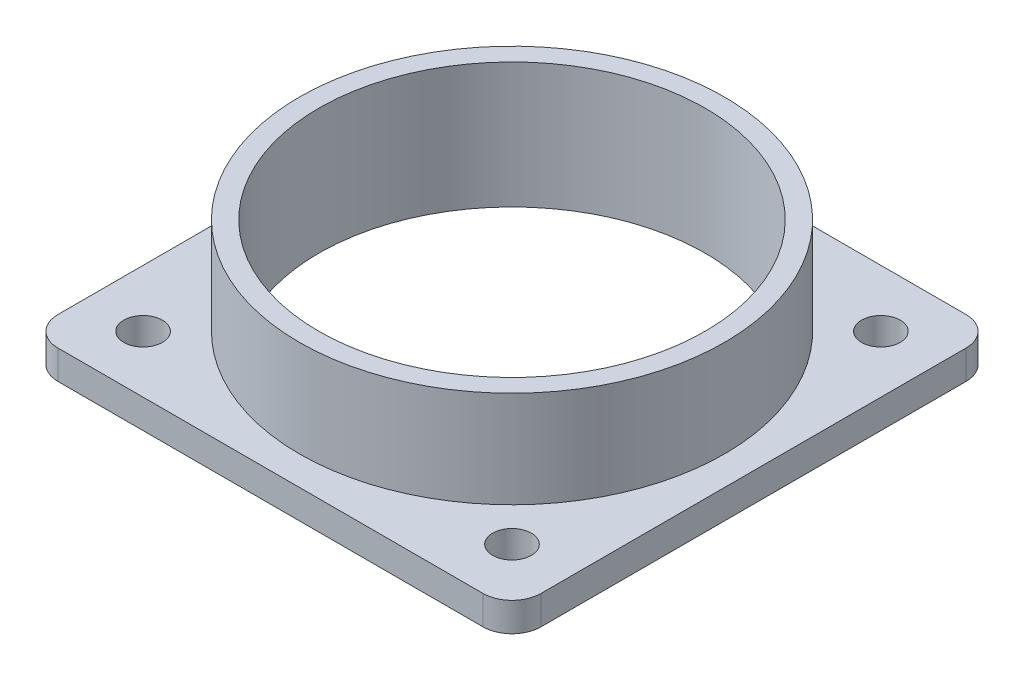
ISO-10303-21;
HEADER;
FILE_DESCRIPTION(('STEP AP214'),'2;1');
FILE_NAME('part.step','',(''),(''),'','','');
FILE_SCHEMA(('AUTOMOTIVE_DESIGN { 1 0 10303 214 1 1 1 1 }'));
ENDSEC;
DATA;
#1=APPLICATION_CONTEXT('core data for automotive mechanical design processes');
#2=APPLICATION_PROTOCOL_DEFINITION('international standard','automotive_design',2000,#1);
#3=PRODUCT_CONTEXT('',#1,'mechanical');
#4=PRODUCT('Part','Part','',(#3));
#5=PRODUCT_RELATED_PRODUCT_CATEGORY('part','',(#4));
#6=PRODUCT_DEFINITION_FORMATION('','',#4);
#7=PRODUCT_DEFINITION_CONTEXT('part definition',#1,'design');
#8=PRODUCT_DEFINITION('design','',#6,#7);
#9=PRODUCT_DEFINITION_SHAPE('','',#8);
#10=(LENGTH_UNIT() NAMED_UNIT(*) SI_UNIT(.MILLI.,.METRE.));
#11=(NAMED_UNIT(*) PLANE_ANGLE_UNIT() SI_UNIT($,.RADIAN.));
#12=(NAMED_UNIT(*) SI_UNIT($,.STERADIAN.) SOLID_ANGLE_UNIT());
#13=UNCERTAINTY_MEASURE_WITH_UNIT(LENGTH_MEASURE(1.E-05),#10,'distance_accuracy_value','');
#14=(GEOMETRIC_REPRESENTATION_CONTEXT(3) GLOBAL_UNCERTAINTY_ASSIGNED_CONTEXT((#13)) GLOBAL_UNIT_ASSIGNED_CONTEXT((#10,
#11,#12)) REPRESENTATION_CONTEXT('',''));
#15=CARTESIAN_POINT('',(0.,0.,0.));
#16=DIRECTION('',(0.,0.,1.));
#17=DIRECTION('',(1.,0.,0.));
#18=AXIS2_PLACEMENT_3D('',#15,#16,#17);
#19=CARTESIAN_POINT('',(0.,3.,0.));
#20=DIRECTION('',(0.,1.,0.));
#21=DIRECTION('',(0.,0.,1.));
#22=AXIS2_PLACEMENT_3D('',#19,#20,#21);
#23=PLANE('',#22);
#24=CARTESIAN_POINT('',(-19.0918830920357,3.,19.0918830920368));
#25=DIRECTION('',(0.,1.,0.));
#26=DIRECTION('',(0.,0.,1.));
#27=AXIS2_PLACEMENT_3D('',#24,#25,#26);
#28=CIRCLE('',#27,2.00000000000058);
#29=CARTESIAN_POINT('',(-19.0918830920357,3.,21.0918830920374));
#30=VERTEX_POINT('',#29);
#31=EDGE_CURVE('E196',#30,#30,#28,.T.);
#32=ORIENTED_EDGE('',*,*,#31,.F.);
#33=EDGE_LOOP('',(#32));
#34=FACE_BOUND('',#33,.T.);
#35=CARTESIAN_POINT('',(19.0918830920368,3.,-19.0918830920379));
#36=DIRECTION('',(0.,1.,0.));
#37=DIRECTION('',(0.,0.,1.));
#38=AXIS2_PLACEMENT_3D('',#35,#36,#37);
#39=CIRCLE('',#38,2.00000000000111);
#40=CARTESIAN_POINT('',(19.0918830920368,3.,-17.0918830920367));
#41=VERTEX_POINT('',#40);
#42=EDGE_CURVE('E184',#41,#41,#39,.T.);
#43=ORIENTED_EDGE('',*,*,#42,.F.);
#44=EDGE_LOOP('',(#43));
#45=FACE_BOUND('',#44,.T.);
#46=DIRECTION('',(0.,0.,-1.));
#47=VECTOR('',#46,1.);
#48=CARTESIAN_POINT('',(25.,3.,25.));
#49=LINE('',#48,#47);
#50=CARTESIAN_POINT('',(25.,3.,22.));
#51=VERTEX_POINT('',#50);
#52=CARTESIAN_POINT('',(25.,3.,-22.));
#53=VERTEX_POINT('',#52);
#54=EDGE_CURVE('E137',#51,#53,#49,.T.);
#55=ORIENTED_EDGE('',*,*,#54,.T.);
#56=CARTESIAN_POINT('',(22.,3.,-22.));
#57=DIRECTION('',(0.,1.,0.));
#58=DIRECTION('',(0.,0.,1.));
#59=AXIS2_PLACEMENT_3D('',#56,#57,#58);
#60=CIRCLE('',#59,3.);
#61=CARTESIAN_POINT('',(22.,3.,-25.));
#62=VERTEX_POINT('',#61);
#63=EDGE_CURVE('E156',#53,#62,#60,.T.);
#64=ORIENTED_EDGE('',*,*,#63,.T.);
#65=DIRECTION('',(-1.,0.,0.));
#66=VECTOR('',#65,1.);
#67=CARTESIAN_POINT('',(25.,3.,-25.));
#68=LINE('',#67,#66);
#69=CARTESIAN_POINT('',(-22.,3.,-25.));
#70=VERTEX_POINT('',#69);
#71=EDGE_CURVE('E120',#62,#70,#68,.T.);
#72=ORIENTED_EDGE('',*,*,#71,.T.);
#73=CARTESIAN_POINT('',(-22.,3.,-22.));
#74=DIRECTION('',(0.,1.,0.));
#75=DIRECTION('',(0.,0.,1.));
#76=AXIS2_PLACEMENT_3D('',#73,#74,#75);
#77=CIRCLE('',#76,3.);
#78=CARTESIAN_POINT('',(-25.,3.,-22.));
#79=VERTEX_POINT('',#78);
#80=EDGE_CURVE('E151',#70,#79,#77,.T.);
#81=ORIENTED_EDGE('',*,*,#80,.T.);
#82=DIRECTION('',(0.,0.,1.));
#83=VECTOR('',#82,1.);
#84=CARTESIAN_POINT('',(-25.,3.,-25.));
#85=LINE('',#84,#83);
#86=CARTESIAN_POINT('',(-25.,3.,22.));
#87=VERTEX_POINT('',#86);
#88=EDGE_CURVE('E167',#79,#87,#85,.T.);
#89=ORIENTED_EDGE('',*,*,#88,.T.);
#90=CARTESIAN_POINT('',(-22.,3.,22.));
#91=DIRECTION('',(0.,1.,0.));
#92=DIRECTION('',(0.,0.,1.));
#93=AXIS2_PLACEMENT_3D('',#90,#91,#92);
#94=CIRCLE('',#93,3.);
#95=CARTESIAN_POINT('',(-22.,3.,25.));
#96=VERTEX_POINT('',#95);
#97=EDGE_CURVE('E56',#87,#96,#94,.T.);
#98=ORIENTED_EDGE('',*,*,#97,.T.);
#99=DIRECTION('',(1.,0.,0.));
#100=VECTOR('',#99,1.);
#101=CARTESIAN_POINT('',(-25.,3.,25.));
#102=LINE('',#101,#100);
#103=CARTESIAN_POINT('',(22.,3.,25.));
#104=VERTEX_POINT('',#103);
#105=EDGE_CURVE('E175',#96,#104,#102,.T.);
#106=ORIENTED_EDGE('',*,*,#105,.T.);
#107=CARTESIAN_POINT('',(22.,3.,22.));
#108=DIRECTION('',(0.,1.,0.));
#109=DIRECTION('',(0.,0.,1.));
#110=AXIS2_PLACEMENT_3D('',#107,#108,#109);
#111=CIRCLE('',#110,3.);
#112=EDGE_CURVE('E154',#104,#51,#111,.T.);
#113=ORIENTED_EDGE('',*,*,#112,.T.);
#114=EDGE_LOOP('',(#55,#64,#72,#81,#89,#98,#106,#113));
#115=FACE_BOUND('',#114,.T.);
#116=CARTESIAN_POINT('',(-19.0918830920368,3.,-19.0918830920368));
#117=DIRECTION('',(0.,1.,0.));
#118=DIRECTION('',(0.,0.,1.));
#119=AXIS2_PLACEMENT_3D('',#116,#117,#118);
#120=CIRCLE('',#119,2.);
#121=CARTESIAN_POINT('',(-19.0918830920368,3.,-17.0918830920368));
#122=VERTEX_POINT('',#121);
#123=EDGE_CURVE('E134',#122,#122,#120,.T.);
#124=ORIENTED_EDGE('',*,*,#123,.F.);
#125=EDGE_LOOP('',(#124));
#126=FACE_BOUND('',#125,.T.);
#127=CARTESIAN_POINT('',(19.0918830920379,3.,19.0918830920357));
#128=DIRECTION('',(0.,1.,0.));
#129=DIRECTION('',(0.,0.,1.));
#130=AXIS2_PLACEMENT_3D('',#127,#128,#129);
#131=CIRCLE('',#130,2.00000000000152);
#132=CARTESIAN_POINT('',(19.0918830920379,3.,21.0918830920372));
#133=VERTEX_POINT('',#132);
#134=EDGE_CURVE('E190',#133,#133,#131,.T.);
#135=ORIENTED_EDGE('',*,*,#134,.F.);
#136=EDGE_LOOP('',(#135));
#137=FACE_BOUND('',#136,.T.);
#138=CARTESIAN_POINT('',(0.,3.,0.));
#139=DIRECTION('',(0.,1.,0.));
#140=DIRECTION('',(0.,0.,1.));
#141=AXIS2_PLACEMENT_3D('',#138,#139,#140);
#142=CIRCLE('',#141,22.);
#143=CARTESIAN_POINT('',(0.,3.,22.));
#144=VERTEX_POINT('',#143);
#145=EDGE_CURVE('E205',#144,#144,#142,.T.);
#146=ORIENTED_EDGE('',*,*,#145,.F.);
#147=EDGE_LOOP('',(#146));
#148=FACE_BOUND('',#147,.T.);
#149=ADVANCED_FACE('F34',(#34,#45,#115,#126,#137,#148),#23,.T.);
#150=CARTESIAN_POINT('',(0.,0.,0.));
#151=DIRECTION('',(0.,1.,0.));
#152=DIRECTION('',(0.,0.,1.));
#153=AXIS2_PLACEMENT_3D('',#150,#151,#152);
#154=PLANE('',#153);
#155=DIRECTION('',(-1.,0.,0.));
#156=VECTOR('',#155,1.);
#157=CARTESIAN_POINT('',(0.,0.,-25.));
#158=LINE('',#157,#156);
#159=CARTESIAN_POINT('',(22.,0.,-25.));
#160=VERTEX_POINT('',#159);
#161=CARTESIAN_POINT('',(-22.,0.,-25.));
#162=VERTEX_POINT('',#161);
#163=EDGE_CURVE('E117',#160,#162,#158,.T.);
#164=ORIENTED_EDGE('',*,*,#163,.F.);
#165=CARTESIAN_POINT('',(22.,0.,-22.));
#166=DIRECTION('',(0.,1.,0.));
#167=DIRECTION('',(0.,0.,1.));
#168=AXIS2_PLACEMENT_3D('',#165,#166,#167);
#169=CIRCLE('',#168,3.);
#170=CARTESIAN_POINT('',(25.,0.,-22.));
#171=VERTEX_POINT('',#170);
#172=EDGE_CURVE('E100',#160,#171,#169,.F.);
#173=ORIENTED_EDGE('',*,*,#172,.T.);
#174=DIRECTION('',(0.,0.,-1.));
#175=VECTOR('',#174,1.);
#176=CARTESIAN_POINT('',(25.,0.,25.));
#177=LINE('',#176,#175);
#178=CARTESIAN_POINT('',(25.,0.,22.));
#179=VERTEX_POINT('',#178);
#180=EDGE_CURVE('E141',#179,#171,#177,.T.);
#181=ORIENTED_EDGE('',*,*,#180,.F.);
#182=CARTESIAN_POINT('',(22.,0.,22.));
#183=DIRECTION('',(0.,1.,0.));
#184=DIRECTION('',(0.,0.,1.));
#185=AXIS2_PLACEMENT_3D('',#182,#183,#184);
#186=CIRCLE('',#185,3.);
#187=CARTESIAN_POINT('',(22.,0.,25.));
#188=VERTEX_POINT('',#187);
#189=EDGE_CURVE('E111',#179,#188,#186,.F.);
#190=ORIENTED_EDGE('',*,*,#189,.T.);
#191=DIRECTION('',(1.,0.,0.));
#192=VECTOR('',#191,1.);
#193=CARTESIAN_POINT('',(-25.,0.,25.));
#194=LINE('',#193,#192);
#195=CARTESIAN_POINT('',(-22.,0.,25.));
#196=VERTEX_POINT('',#195);
#197=EDGE_CURVE('E131',#196,#188,#194,.T.);
#198=ORIENTED_EDGE('',*,*,#197,.F.);
#199=CARTESIAN_POINT('',(-22.,0.,22.));
#200=DIRECTION('',(0.,1.,0.));
#201=DIRECTION('',(0.,0.,1.));
#202=AXIS2_PLACEMENT_3D('',#199,#200,#201);
#203=CIRCLE('',#202,3.);
#204=CARTESIAN_POINT('',(-25.,0.,22.));
#205=VERTEX_POINT('',#204);
#206=EDGE_CURVE('E145',#196,#205,#203,.F.);
#207=ORIENTED_EDGE('',*,*,#206,.T.);
#208=DIRECTION('',(0.,0.,1.));
#209=VECTOR('',#208,1.);
#210=CARTESIAN_POINT('',(-25.,0.,-25.));
#211=LINE('',#210,#209);
#212=CARTESIAN_POINT('',(-25.,0.,-22.));
#213=VERTEX_POINT('',#212);
#214=EDGE_CURVE('E127',#213,#205,#211,.T.);
#215=ORIENTED_EDGE('',*,*,#214,.F.);
#216=CARTESIAN_POINT('',(-22.,0.,-22.));
#217=DIRECTION('',(0.,1.,0.));
#218=DIRECTION('',(0.,0.,1.));
#219=AXIS2_PLACEMENT_3D('',#216,#217,#218);
#220=CIRCLE('',#219,3.);
#221=EDGE_CURVE('E121',#213,#162,#220,.F.);
#222=ORIENTED_EDGE('',*,*,#221,.T.);
#223=EDGE_LOOP('',(#164,#173,#181,#190,#198,#207,#215,#222));
#224=FACE_BOUND('',#223,.T.);
#225=CARTESIAN_POINT('',(0.,0.,0.));
#226=DIRECTION('',(0.,1.,0.));
#227=DIRECTION('',(0.,0.,1.));
#228=AXIS2_PLACEMENT_3D('',#225,#226,#227);
#229=CIRCLE('',#228,20.);
#230=CARTESIAN_POINT('',(0.,0.,20.));
#231=VERTEX_POINT('',#230);
#232=EDGE_CURVE('E128',#231,#231,#229,.T.);
#233=ORIENTED_EDGE('',*,*,#232,.T.);
#234=EDGE_LOOP('',(#233));
#235=FACE_BOUND('',#234,.T.);
#236=CARTESIAN_POINT('',(-19.0918830920368,0.,-19.0918830920368));
#237=DIRECTION('',(0.,1.,0.));
#238=DIRECTION('',(0.,0.,1.));
#239=AXIS2_PLACEMENT_3D('',#236,#237,#238);
#240=CIRCLE('',#239,2.);
#241=CARTESIAN_POINT('',(-19.0918830920368,0.,-17.0918830920368));
#242=VERTEX_POINT('',#241);
#243=EDGE_CURVE('E181',#242,#242,#240,.T.);
#244=ORIENTED_EDGE('',*,*,#243,.T.);
#245=EDGE_LOOP('',(#244));
#246=FACE_BOUND('',#245,.T.);
#247=CARTESIAN_POINT('',(19.0918830920368,0.,-19.0918830920379));
#248=DIRECTION('',(0.,1.,0.));
#249=DIRECTION('',(0.,0.,1.));
#250=AXIS2_PLACEMENT_3D('',#247,#248,#249);
#251=CIRCLE('',#250,2.00000000000111);
#252=CARTESIAN_POINT('',(19.0918830920368,0.,-17.0918830920367));
#253=VERTEX_POINT('',#252);
#254=EDGE_CURVE('E187',#253,#253,#251,.T.);
#255=ORIENTED_EDGE('',*,*,#254,.T.);
#256=EDGE_LOOP('',(#255));
#257=FACE_BOUND('',#256,.T.);
#258=CARTESIAN_POINT('',(19.0918830920379,0.,19.0918830920357));
#259=DIRECTION('',(0.,1.,0.));
#260=DIRECTION('',(0.,0.,1.));
#261=AXIS2_PLACEMENT_3D('',#258,#259,#260);
#262=CIRCLE('',#261,2.00000000000152);
#263=CARTESIAN_POINT('',(19.0918830920379,0.,21.0918830920372));
#264=VERTEX_POINT('',#263);
#265=EDGE_CURVE('E193',#264,#264,#262,.T.);
#266=ORIENTED_EDGE('',*,*,#265,.T.);
#267=EDGE_LOOP('',(#266));
#268=FACE_BOUND('',#267,.T.);
#269=CARTESIAN_POINT('',(-19.0918830920357,0.,19.0918830920368));
#270=DIRECTION('',(0.,1.,0.));
#271=DIRECTION('',(0.,0.,1.));
#272=AXIS2_PLACEMENT_3D('',#269,#270,#271);
#273=CIRCLE('',#272,2.00000000000058);
#274=CARTESIAN_POINT('',(-19.0918830920357,0.,21.0918830920374));
#275=VERTEX_POINT('',#274);
#276=EDGE_CURVE('E199',#275,#275,#273,.T.);
#277=ORIENTED_EDGE('',*,*,#276,.T.);
#278=EDGE_LOOP('',(#277));
#279=FACE_BOUND('',#278,.T.);
#280=ADVANCED_FACE('F124',(#224,#235,#246,#257,#268,#279),#154,.F.);
#281=CARTESIAN_POINT('',(0.,3.,-25.));
#282=DIRECTION('',(0.,0.,1.));
#283=DIRECTION('',(1.,0.,0.));
#284=AXIS2_PLACEMENT_3D('',#281,#282,#283);
#285=PLANE('',#284);
#286=ORIENTED_EDGE('',*,*,#71,.F.);
#287=DIRECTION('',(0.,-1.,0.));
#288=VECTOR('',#287,1.);
#289=CARTESIAN_POINT('',(22.,3.,-25.));
#290=LINE('',#289,#288);
#291=EDGE_CURVE('E104',#62,#160,#290,.T.);
#292=ORIENTED_EDGE('',*,*,#291,.T.);
#293=ORIENTED_EDGE('',*,*,#163,.T.);
#294=DIRECTION('',(0.,-1.,0.));
#295=VECTOR('',#294,1.);
#296=CARTESIAN_POINT('',(-22.,3.,-25.));
#297=LINE('',#296,#295);
#298=EDGE_CURVE('E122',#162,#70,#297,.F.);
#299=ORIENTED_EDGE('',*,*,#298,.T.);
#300=EDGE_LOOP('',(#286,#292,#293,#299));
#301=FACE_BOUND('',#300,.T.);
#302=ADVANCED_FACE('F116',(#301),#285,.F.);
#303=CARTESIAN_POINT('',(-25.,3.,-25.));
#304=DIRECTION('',(1.,0.,0.));
#305=DIRECTION('',(0.,0.,-1.));
#306=AXIS2_PLACEMENT_3D('',#303,#304,#305);
#307=PLANE('',#306);
#308=ORIENTED_EDGE('',*,*,#214,.T.);
#309=DIRECTION('',(0.,-1.,0.));
#310=VECTOR('',#309,1.);
#311=CARTESIAN_POINT('',(-25.,3.,22.));
#312=LINE('',#311,#310);
#313=EDGE_CURVE('E11',#205,#87,#312,.F.);
#314=ORIENTED_EDGE('',*,*,#313,.T.);
#315=ORIENTED_EDGE('',*,*,#88,.F.);
#316=DIRECTION('',(0.,-1.,0.));
#317=VECTOR('',#316,1.);
#318=CARTESIAN_POINT('',(-25.,3.,-22.));
#319=LINE('',#318,#317);
#320=EDGE_CURVE('E42',#79,#213,#319,.T.);
#321=ORIENTED_EDGE('',*,*,#320,.T.);
#322=EDGE_LOOP('',(#308,#314,#315,#321));
#323=FACE_BOUND('',#322,.T.);
#324=ADVANCED_FACE('F165',(#323),#307,.F.);
#325=CARTESIAN_POINT('',(-25.,3.,25.));
#326=DIRECTION('',(0.,0.,-1.));
#327=DIRECTION('',(-1.,0.,0.));
#328=AXIS2_PLACEMENT_3D('',#325,#326,#327);
#329=PLANE('',#328);
#330=ORIENTED_EDGE('',*,*,#197,.T.);
#331=DIRECTION('',(0.,-1.,0.));
#332=VECTOR('',#331,1.);
#333=CARTESIAN_POINT('',(22.,3.,25.));
#334=LINE('',#333,#332);
#335=EDGE_CURVE('E49',#188,#104,#334,.F.);
#336=ORIENTED_EDGE('',*,*,#335,.T.);
#337=ORIENTED_EDGE('',*,*,#105,.F.);
#338=DIRECTION('',(0.,-1.,0.));
#339=VECTOR('',#338,1.);
#340=CARTESIAN_POINT('',(-22.,3.,25.));
#341=LINE('',#340,#339);
#342=EDGE_CURVE('E158',#96,#196,#341,.T.);
#343=ORIENTED_EDGE('',*,*,#342,.T.);
#344=EDGE_LOOP('',(#330,#336,#337,#343));
#345=FACE_BOUND('',#344,.T.);
#346=ADVANCED_FACE('F174',(#345),#329,.F.);
#347=CARTESIAN_POINT('',(25.,3.,25.));
#348=DIRECTION('',(-1.,0.,0.));
#349=DIRECTION('',(0.,0.,1.));
#350=AXIS2_PLACEMENT_3D('',#347,#348,#349);
#351=PLANE('',#350);
#352=ORIENTED_EDGE('',*,*,#180,.T.);
#353=DIRECTION('',(0.,-1.,0.));
#354=VECTOR('',#353,1.);
#355=CARTESIAN_POINT('',(25.,3.,-22.));
#356=LINE('',#355,#354);
#357=EDGE_CURVE('E105',#171,#53,#356,.F.);
#358=ORIENTED_EDGE('',*,*,#357,.T.);
#359=ORIENTED_EDGE('',*,*,#54,.F.);
#360=DIRECTION('',(0.,-1.,0.));
#361=VECTOR('',#360,1.);
#362=CARTESIAN_POINT('',(25.,3.,22.));
#363=LINE('',#362,#361);
#364=EDGE_CURVE('E110',#51,#179,#363,.T.);
#365=ORIENTED_EDGE('',*,*,#364,.T.);
#366=EDGE_LOOP('',(#352,#358,#359,#365));
#367=FACE_BOUND('',#366,.T.);
#368=ADVANCED_FACE('F239',(#367),#351,.F.);
#369=CARTESIAN_POINT('',(0.,3.,0.));
#370=DIRECTION('',(0.,-1.,0.));
#371=DIRECTION('',(0.,0.,-1.));
#372=AXIS2_PLACEMENT_3D('',#369,#370,#371);
#373=CYLINDRICAL_SURFACE('',#372,20.);
#374=ORIENTED_EDGE('',*,*,#232,.F.);
#375=EDGE_LOOP('',(#374));
#376=FACE_BOUND('',#375,.T.);
#377=CARTESIAN_POINT('',(0.,13.,0.));
#378=DIRECTION('',(0.,1.,0.));
#379=DIRECTION('',(0.,0.,1.));
#380=AXIS2_PLACEMENT_3D('',#377,#378,#379);
#381=CIRCLE('',#380,20.);
#382=CARTESIAN_POINT('',(0.,13.,20.));
#383=VERTEX_POINT('',#382);
#384=EDGE_CURVE('E208',#383,#383,#381,.T.);
#385=ORIENTED_EDGE('',*,*,#384,.T.);
#386=EDGE_LOOP('',(#385));
#387=FACE_BOUND('',#386,.T.);
#388=ADVANCED_FACE('F214',(#376,#387),#373,.F.);
#389=CARTESIAN_POINT('',(-19.0918830920368,3.,-19.0918830920368));
#390=DIRECTION('',(0.,-1.,0.));
#391=DIRECTION('',(0.,0.,-1.));
#392=AXIS2_PLACEMENT_3D('',#389,#390,#391);
#393=CYLINDRICAL_SURFACE('',#392,2.);
#394=ORIENTED_EDGE('',*,*,#123,.T.);
#395=EDGE_LOOP('',(#394));
#396=FACE_BOUND('',#395,.T.);
#397=ORIENTED_EDGE('',*,*,#243,.F.);
#398=EDGE_LOOP('',(#397));
#399=FACE_BOUND('',#398,.T.);
#400=ADVANCED_FACE('F276',(#396,#399),#393,.F.);
#401=CARTESIAN_POINT('',(19.0918830920368,3.,-19.0918830920379));
#402=DIRECTION('',(0.,-1.,0.));
#403=DIRECTION('',(0.,0.,-1.));
#404=AXIS2_PLACEMENT_3D('',#401,#402,#403);
#405=CYLINDRICAL_SURFACE('',#404,2.00000000000111);
#406=ORIENTED_EDGE('',*,*,#42,.T.);
#407=EDGE_LOOP('',(#406));
#408=FACE_BOUND('',#407,.T.);
#409=ORIENTED_EDGE('',*,*,#254,.F.);
#410=EDGE_LOOP('',(#409));
#411=FACE_BOUND('',#410,.T.);
#412=ADVANCED_FACE('F298',(#408,#411),#405,.F.);
#413=CARTESIAN_POINT('',(19.0918830920379,3.,19.0918830920357));
#414=DIRECTION('',(0.,-1.,0.));
#415=DIRECTION('',(0.,0.,-1.));
#416=AXIS2_PLACEMENT_3D('',#413,#414,#415);
#417=CYLINDRICAL_SURFACE('',#416,2.00000000000152);
#418=ORIENTED_EDGE('',*,*,#134,.T.);
#419=EDGE_LOOP('',(#418));
#420=FACE_BOUND('',#419,.T.);
#421=ORIENTED_EDGE('',*,*,#265,.F.);
#422=EDGE_LOOP('',(#421));
#423=FACE_BOUND('',#422,.T.);
#424=ADVANCED_FACE('F305',(#420,#423),#417,.F.);
#425=CARTESIAN_POINT('',(-19.0918830920357,3.,19.0918830920368));
#426=DIRECTION('',(0.,-1.,0.));
#427=DIRECTION('',(0.,0.,-1.));
#428=AXIS2_PLACEMENT_3D('',#425,#426,#427);
#429=CYLINDRICAL_SURFACE('',#428,2.00000000000058);
#430=ORIENTED_EDGE('',*,*,#31,.T.);
#431=EDGE_LOOP('',(#430));
#432=FACE_BOUND('',#431,.T.);
#433=ORIENTED_EDGE('',*,*,#276,.F.);
#434=EDGE_LOOP('',(#433));
#435=FACE_BOUND('',#434,.T.);
#436=ADVANCED_FACE('F252',(#432,#435),#429,.F.);
#437=CARTESIAN_POINT('',(22.,3.,-22.));
#438=DIRECTION('',(0.,-1.,0.));
#439=DIRECTION('',(0.,0.,-1.));
#440=AXIS2_PLACEMENT_3D('',#437,#438,#439);
#441=CYLINDRICAL_SURFACE('',#440,3.);
#442=ORIENTED_EDGE('',*,*,#63,.F.);
#443=ORIENTED_EDGE('',*,*,#357,.F.);
#444=ORIENTED_EDGE('',*,*,#172,.F.);
#445=ORIENTED_EDGE('',*,*,#291,.F.);
#446=EDGE_LOOP('',(#442,#443,#444,#445));
#447=FACE_BOUND('',#446,.T.);
#448=ADVANCED_FACE('F103',(#447),#441,.T.);
#449=CARTESIAN_POINT('',(22.,3.,22.));
#450=DIRECTION('',(0.,-1.,0.));
#451=DIRECTION('',(0.,0.,-1.));
#452=AXIS2_PLACEMENT_3D('',#449,#450,#451);
#453=CYLINDRICAL_SURFACE('',#452,3.);
#454=ORIENTED_EDGE('',*,*,#112,.F.);
#455=ORIENTED_EDGE('',*,*,#335,.F.);
#456=ORIENTED_EDGE('',*,*,#189,.F.);
#457=ORIENTED_EDGE('',*,*,#364,.F.);
#458=EDGE_LOOP('',(#454,#455,#456,#457));
#459=FACE_BOUND('',#458,.T.);
#460=ADVANCED_FACE('F251',(#459),#453,.T.);
#461=CARTESIAN_POINT('',(-22.,3.,22.));
#462=DIRECTION('',(0.,-1.,0.));
#463=DIRECTION('',(0.,0.,-1.));
#464=AXIS2_PLACEMENT_3D('',#461,#462,#463);
#465=CYLINDRICAL_SURFACE('',#464,3.);
#466=ORIENTED_EDGE('',*,*,#97,.F.);
#467=ORIENTED_EDGE('',*,*,#313,.F.);
#468=ORIENTED_EDGE('',*,*,#206,.F.);
#469=ORIENTED_EDGE('',*,*,#342,.F.);
#470=EDGE_LOOP('',(#466,#467,#468,#469));
#471=FACE_BOUND('',#470,.T.);
#472=ADVANCED_FACE('F173',(#471),#465,.T.);
#473=CARTESIAN_POINT('',(-22.,3.,-22.));
#474=DIRECTION('',(0.,-1.,0.));
#475=DIRECTION('',(0.,0.,-1.));
#476=AXIS2_PLACEMENT_3D('',#473,#474,#475);
#477=CYLINDRICAL_SURFACE('',#476,3.);
#478=ORIENTED_EDGE('',*,*,#80,.F.);
#479=ORIENTED_EDGE('',*,*,#298,.F.);
#480=ORIENTED_EDGE('',*,*,#221,.F.);
#481=ORIENTED_EDGE('',*,*,#320,.F.);
#482=EDGE_LOOP('',(#478,#479,#480,#481));
#483=FACE_BOUND('',#482,.T.);
#484=ADVANCED_FACE('F36',(#483),#477,.T.);
#485=CARTESIAN_POINT('',(0.,13.,0.));
#486=DIRECTION('',(0.,1.,0.));
#487=DIRECTION('',(0.,0.,1.));
#488=AXIS2_PLACEMENT_3D('',#485,#486,#487);
#489=PLANE('',#488);
#490=CARTESIAN_POINT('',(0.,13.,0.));
#491=DIRECTION('',(0.,1.,0.));
#492=DIRECTION('',(0.,0.,1.));
#493=AXIS2_PLACEMENT_3D('',#490,#491,#492);
#494=CIRCLE('',#493,22.);
#495=CARTESIAN_POINT('',(0.,13.,22.));
#496=VERTEX_POINT('',#495);
#497=EDGE_CURVE('E202',#496,#496,#494,.T.);
#498=ORIENTED_EDGE('',*,*,#497,.T.);
#499=EDGE_LOOP('',(#498));
#500=FACE_BOUND('',#499,.T.);
#501=ORIENTED_EDGE('',*,*,#384,.F.);
#502=EDGE_LOOP('',(#501));
#503=FACE_BOUND('',#502,.T.);
#504=ADVANCED_FACE('F216',(#500,#503),#489,.T.);
#505=CARTESIAN_POINT('',(0.,13.,0.));
#506=DIRECTION('',(0.,-1.,0.));
#507=DIRECTION('',(0.,0.,-1.));
#508=AXIS2_PLACEMENT_3D('',#505,#506,#507);
#509=CYLINDRICAL_SURFACE('',#508,22.);
#510=ORIENTED_EDGE('',*,*,#497,.F.);
#511=EDGE_LOOP('',(#510));
#512=FACE_BOUND('',#511,.T.);
#513=ORIENTED_EDGE('',*,*,#145,.T.);
#514=EDGE_LOOP('',(#513));
#515=FACE_BOUND('',#514,.T.);
#516=ADVANCED_FACE('F218',(#512,#515),#509,.T.);
#517=CLOSED_SHELL('',(#149,#280,#302,#324,#346,#368,#388,#400,#412,#424,#436,#448,#460,#472,
#484,#504,#516));
#518=MANIFOLD_SOLID_BREP('B2',#517);
#519=ADVANCED_BREP_SHAPE_REPRESENTATION('',(#18,#518),#14);
#520=SHAPE_DEFINITION_REPRESENTATION(#9,#519);
ENDSEC;
END-ISO-10303-21;
